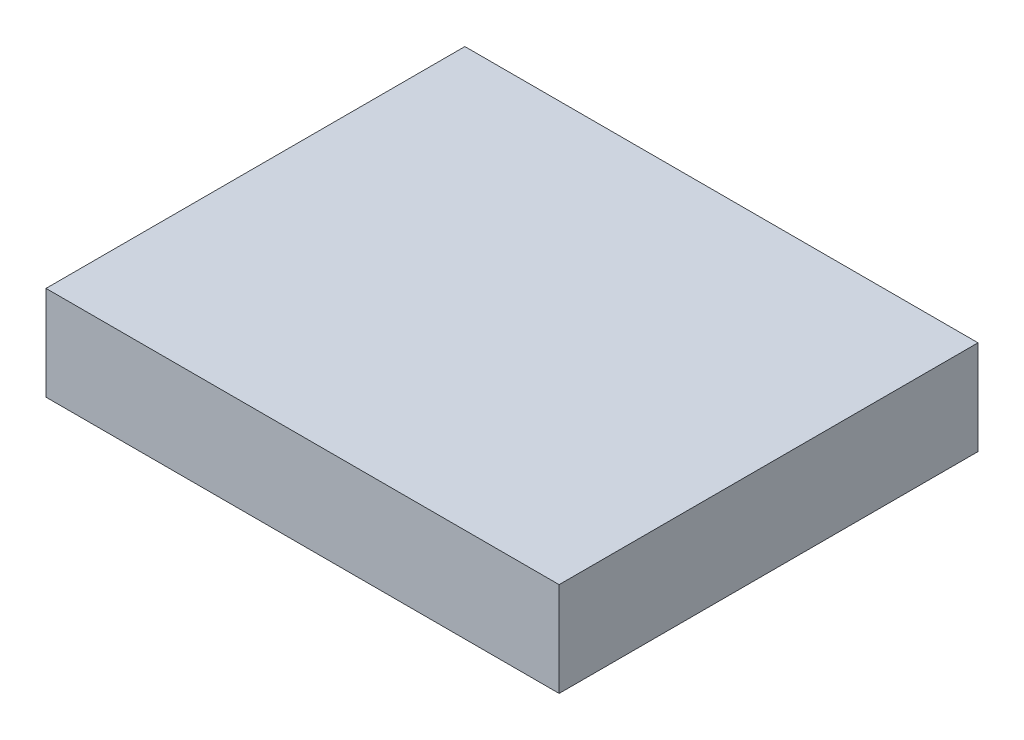
ISO-10303-21;
HEADER;
FILE_DESCRIPTION(('STEP AP214'),'2;1');
FILE_NAME('part.step','',(''),(''),'','','');
FILE_SCHEMA(('AUTOMOTIVE_DESIGN { 1 0 10303 214 1 1 1 1 }'));
ENDSEC;
DATA;
#1=APPLICATION_CONTEXT('core data for automotive mechanical design processes');
#2=APPLICATION_PROTOCOL_DEFINITION('international standard','automotive_design',2000,#1);
#3=PRODUCT_CONTEXT('',#1,'mechanical');
#4=PRODUCT('Part','Part','',(#3));
#5=PRODUCT_RELATED_PRODUCT_CATEGORY('part','',(#4));
#6=PRODUCT_DEFINITION_FORMATION('','',#4);
#7=PRODUCT_DEFINITION_CONTEXT('part definition',#1,'design');
#8=PRODUCT_DEFINITION('design','',#6,#7);
#9=PRODUCT_DEFINITION_SHAPE('','',#8);
#10=(LENGTH_UNIT() NAMED_UNIT(*) SI_UNIT(.MILLI.,.METRE.));
#11=(NAMED_UNIT(*) PLANE_ANGLE_UNIT() SI_UNIT($,.RADIAN.));
#12=(NAMED_UNIT(*) SI_UNIT($,.STERADIAN.) SOLID_ANGLE_UNIT());
#13=UNCERTAINTY_MEASURE_WITH_UNIT(LENGTH_MEASURE(1.E-05),#10,'distance_accuracy_value','');
#14=(GEOMETRIC_REPRESENTATION_CONTEXT(3) GLOBAL_UNCERTAINTY_ASSIGNED_CONTEXT((#13)) GLOBAL_UNIT_ASSIGNED_CONTEXT((#10,
#11,#12)) REPRESENTATION_CONTEXT('',''));
#15=CARTESIAN_POINT('',(0.,0.,0.));
#16=DIRECTION('',(0.,0.,1.));
#17=DIRECTION('',(1.,0.,0.));
#18=AXIS2_PLACEMENT_3D('',#15,#16,#17);
#19=CARTESIAN_POINT('',(-36.75,6.75,30.));
#20=DIRECTION('',(1.,0.,0.));
#21=DIRECTION('',(0.,0.,-1.));
#22=AXIS2_PLACEMENT_3D('',#19,#20,#21);
#23=PLANE('',#22);
#24=DIRECTION('',(0.,-1.,0.));
#25=VECTOR('',#24,1.);
#26=CARTESIAN_POINT('',(-36.75,6.75,-30.));
#27=LINE('',#26,#25);
#28=CARTESIAN_POINT('',(-36.75,6.75,-30.));
#29=VERTEX_POINT('',#28);
#30=CARTESIAN_POINT('',(-36.75,-6.75,-30.));
#31=VERTEX_POINT('',#30);
#32=EDGE_CURVE('E107',#29,#31,#27,.T.);
#33=ORIENTED_EDGE('',*,*,#32,.T.);
#34=DIRECTION('',(0.,0.,-1.));
#35=VECTOR('',#34,1.);
#36=CARTESIAN_POINT('',(-36.75,-6.75,30.));
#37=LINE('',#36,#35);
#38=CARTESIAN_POINT('',(-36.75,-6.75,30.));
#39=VERTEX_POINT('',#38);
#40=EDGE_CURVE('E11',#39,#31,#37,.T.);
#41=ORIENTED_EDGE('',*,*,#40,.F.);
#42=DIRECTION('',(0.,-1.,0.));
#43=VECTOR('',#42,1.);
#44=CARTESIAN_POINT('',(-36.75,6.75,30.));
#45=LINE('',#44,#43);
#46=CARTESIAN_POINT('',(-36.75,6.75,30.));
#47=VERTEX_POINT('',#46);
#48=EDGE_CURVE('E91',#47,#39,#45,.T.);
#49=ORIENTED_EDGE('',*,*,#48,.F.);
#50=DIRECTION('',(0.,0.,-1.));
#51=VECTOR('',#50,1.);
#52=CARTESIAN_POINT('',(-36.75,6.75,30.));
#53=LINE('',#52,#51);
#54=EDGE_CURVE('E103',#47,#29,#53,.T.);
#55=ORIENTED_EDGE('',*,*,#54,.T.);
#56=EDGE_LOOP('',(#33,#41,#49,#55));
#57=FACE_BOUND('',#56,.T.);
#58=ADVANCED_FACE('F39',(#57),#23,.F.);
#59=CARTESIAN_POINT('',(-36.75,-6.75,30.));
#60=DIRECTION('',(0.,1.,0.));
#61=DIRECTION('',(-1.,0.,0.));
#62=AXIS2_PLACEMENT_3D('',#59,#60,#61);
#63=PLANE('',#62);
#64=DIRECTION('',(1.,0.,0.));
#65=VECTOR('',#64,1.);
#66=CARTESIAN_POINT('',(-36.75,-6.75,-30.));
#67=LINE('',#66,#65);
#68=CARTESIAN_POINT('',(36.75,-6.75,-30.));
#69=VERTEX_POINT('',#68);
#70=EDGE_CURVE('E96',#31,#69,#67,.T.);
#71=ORIENTED_EDGE('',*,*,#70,.T.);
#72=DIRECTION('',(0.,0.,-1.));
#73=VECTOR('',#72,1.);
#74=CARTESIAN_POINT('',(36.75,-6.75,30.));
#75=LINE('',#74,#73);
#76=CARTESIAN_POINT('',(36.75,-6.75,30.));
#77=VERTEX_POINT('',#76);
#78=EDGE_CURVE('E48',#77,#69,#75,.T.);
#79=ORIENTED_EDGE('',*,*,#78,.F.);
#80=DIRECTION('',(1.,0.,0.));
#81=VECTOR('',#80,1.);
#82=CARTESIAN_POINT('',(-36.75,-6.75,30.));
#83=LINE('',#82,#81);
#84=EDGE_CURVE('E86',#39,#77,#83,.T.);
#85=ORIENTED_EDGE('',*,*,#84,.F.);
#86=ORIENTED_EDGE('',*,*,#40,.T.);
#87=EDGE_LOOP('',(#71,#79,#85,#86));
#88=FACE_BOUND('',#87,.T.);
#89=ADVANCED_FACE('F95',(#88),#63,.F.);
#90=CARTESIAN_POINT('',(36.75,6.75,30.));
#91=DIRECTION('',(-1.,0.,0.));
#92=DIRECTION('',(0.,0.,1.));
#93=AXIS2_PLACEMENT_3D('',#90,#91,#92);
#94=PLANE('',#93);
#95=DIRECTION('',(0.,1.,0.));
#96=VECTOR('',#95,1.);
#97=CARTESIAN_POINT('',(36.75,6.75,-30.));
#98=LINE('',#97,#96);
#99=CARTESIAN_POINT('',(36.75,6.75,-30.));
#100=VERTEX_POINT('',#99);
#101=EDGE_CURVE('E73',#69,#100,#98,.T.);
#102=ORIENTED_EDGE('',*,*,#101,.T.);
#103=DIRECTION('',(0.,0.,-1.));
#104=VECTOR('',#103,1.);
#105=CARTESIAN_POINT('',(36.75,6.75,30.));
#106=LINE('',#105,#104);
#107=CARTESIAN_POINT('',(36.75,6.75,30.));
#108=VERTEX_POINT('',#107);
#109=EDGE_CURVE('E98',#108,#100,#106,.T.);
#110=ORIENTED_EDGE('',*,*,#109,.F.);
#111=DIRECTION('',(0.,1.,0.));
#112=VECTOR('',#111,1.);
#113=CARTESIAN_POINT('',(36.75,6.75,30.));
#114=LINE('',#113,#112);
#115=EDGE_CURVE('E89',#77,#108,#114,.T.);
#116=ORIENTED_EDGE('',*,*,#115,.F.);
#117=ORIENTED_EDGE('',*,*,#78,.T.);
#118=EDGE_LOOP('',(#102,#110,#116,#117));
#119=FACE_BOUND('',#118,.T.);
#120=ADVANCED_FACE('F99',(#119),#94,.F.);
#121=CARTESIAN_POINT('',(-36.75,6.75,30.));
#122=DIRECTION('',(0.,-1.,0.));
#123=DIRECTION('',(0.,0.,-1.));
#124=AXIS2_PLACEMENT_3D('',#121,#122,#123);
#125=PLANE('',#124);
#126=DIRECTION('',(-1.,0.,0.));
#127=VECTOR('',#126,1.);
#128=CARTESIAN_POINT('',(-36.75,6.75,-30.));
#129=LINE('',#128,#127);
#130=EDGE_CURVE('E79',#100,#29,#129,.T.);
#131=ORIENTED_EDGE('',*,*,#130,.T.);
#132=ORIENTED_EDGE('',*,*,#54,.F.);
#133=DIRECTION('',(-1.,0.,0.));
#134=VECTOR('',#133,1.);
#135=CARTESIAN_POINT('',(-36.75,6.75,30.));
#136=LINE('',#135,#134);
#137=EDGE_CURVE('E56',#108,#47,#136,.T.);
#138=ORIENTED_EDGE('',*,*,#137,.F.);
#139=ORIENTED_EDGE('',*,*,#109,.T.);
#140=EDGE_LOOP('',(#131,#132,#138,#139));
#141=FACE_BOUND('',#140,.T.);
#142=ADVANCED_FACE('F120',(#141),#125,.F.);
#143=CARTESIAN_POINT('',(0.,0.,30.));
#144=DIRECTION('',(0.,0.,1.));
#145=DIRECTION('',(1.,0.,0.));
#146=AXIS2_PLACEMENT_3D('',#143,#144,#145);
#147=PLANE('',#146);
#148=ORIENTED_EDGE('',*,*,#48,.T.);
#149=ORIENTED_EDGE('',*,*,#84,.T.);
#150=ORIENTED_EDGE('',*,*,#115,.T.);
#151=ORIENTED_EDGE('',*,*,#137,.T.);
#152=EDGE_LOOP('',(#148,#149,#150,#151));
#153=FACE_BOUND('',#152,.T.);
#154=ADVANCED_FACE('F87',(#153),#147,.T.);
#155=CARTESIAN_POINT('',(0.,0.,-30.));
#156=DIRECTION('',(0.,0.,1.));
#157=DIRECTION('',(1.,0.,0.));
#158=AXIS2_PLACEMENT_3D('',#155,#156,#157);
#159=PLANE('',#158);
#160=ORIENTED_EDGE('',*,*,#32,.F.);
#161=ORIENTED_EDGE('',*,*,#130,.F.);
#162=ORIENTED_EDGE('',*,*,#101,.F.);
#163=ORIENTED_EDGE('',*,*,#70,.F.);
#164=EDGE_LOOP('',(#160,#161,#162,#163));
#165=FACE_BOUND('',#164,.T.);
#166=ADVANCED_FACE('F123',(#165),#159,.F.);
#167=CLOSED_SHELL('',(#58,#89,#120,#142,#154,#166));
#168=MANIFOLD_SOLID_BREP('B2',#167);
#169=ADVANCED_BREP_SHAPE_REPRESENTATION('',(#18,#168),#14);
#170=SHAPE_DEFINITION_REPRESENTATION(#9,#169);
ENDSEC;
END-ISO-10303-21;
